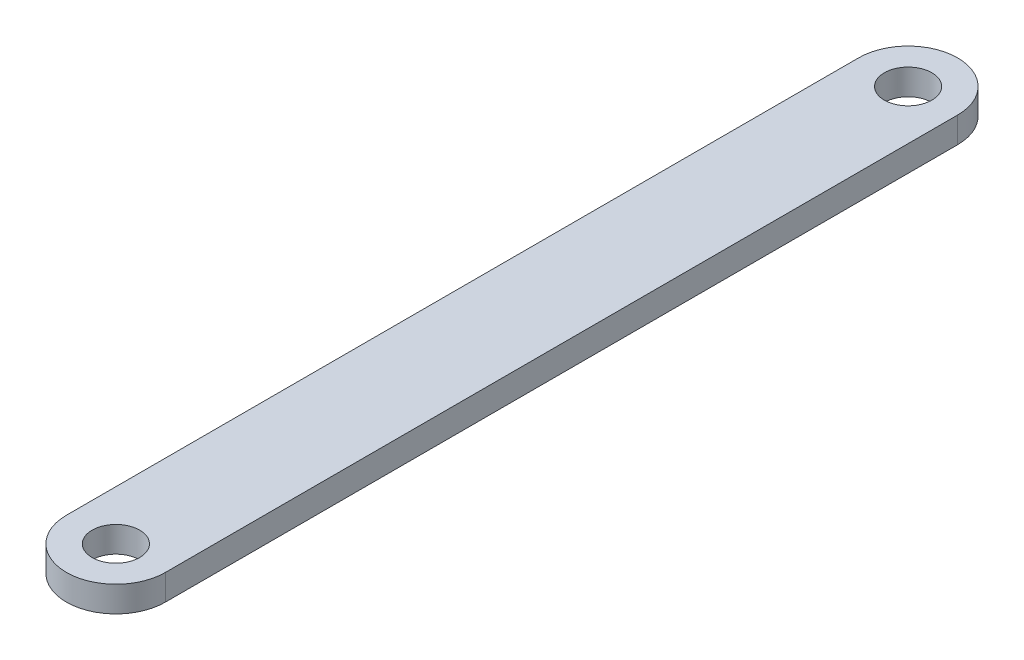
ISO-10303-21;
HEADER;
FILE_DESCRIPTION(('STEP AP214'),'2;1');
FILE_NAME('part.step','',(''),(''),'','','');
FILE_SCHEMA(('AUTOMOTIVE_DESIGN { 1 0 10303 214 1 1 1 1 }'));
ENDSEC;
DATA;
#1=APPLICATION_CONTEXT('core data for automotive mechanical design processes');
#2=APPLICATION_PROTOCOL_DEFINITION('international standard','automotive_design',2000,#1);
#3=PRODUCT_CONTEXT('',#1,'mechanical');
#4=PRODUCT('Part','Part','',(#3));
#5=PRODUCT_RELATED_PRODUCT_CATEGORY('part','',(#4));
#6=PRODUCT_DEFINITION_FORMATION('','',#4);
#7=PRODUCT_DEFINITION_CONTEXT('part definition',#1,'design');
#8=PRODUCT_DEFINITION('design','',#6,#7);
#9=PRODUCT_DEFINITION_SHAPE('','',#8);
#10=(LENGTH_UNIT() NAMED_UNIT(*) SI_UNIT(.MILLI.,.METRE.));
#11=(NAMED_UNIT(*) PLANE_ANGLE_UNIT() SI_UNIT($,.RADIAN.));
#12=(NAMED_UNIT(*) SI_UNIT($,.STERADIAN.) SOLID_ANGLE_UNIT());
#13=UNCERTAINTY_MEASURE_WITH_UNIT(LENGTH_MEASURE(1.E-05),#10,'distance_accuracy_value','');
#14=(GEOMETRIC_REPRESENTATION_CONTEXT(3) GLOBAL_UNCERTAINTY_ASSIGNED_CONTEXT((#13)) GLOBAL_UNIT_ASSIGNED_CONTEXT((#10,
#11,#12)) REPRESENTATION_CONTEXT('',''));
#15=CARTESIAN_POINT('',(0.,0.,0.));
#16=DIRECTION('',(0.,0.,1.));
#17=DIRECTION('',(1.,0.,0.));
#18=AXIS2_PLACEMENT_3D('',#15,#16,#17);
#19=CARTESIAN_POINT('',(0.,3.25,0.));
#20=DIRECTION('',(0.,1.,0.));
#21=DIRECTION('',(0.,0.,1.));
#22=AXIS2_PLACEMENT_3D('',#19,#20,#21);
#23=PLANE('',#22);
#24=CARTESIAN_POINT('',(0.,3.25,-200.));
#25=DIRECTION('',(0.,1.,0.));
#26=DIRECTION('',(0.,0.,1.));
#27=AXIS2_PLACEMENT_3D('',#24,#25,#26);
#28=CIRCLE('',#27,6.);
#29=CARTESIAN_POINT('',(0.,3.25,-206.));
#30=VERTEX_POINT('',#29);
#31=EDGE_CURVE('E106',#30,#30,#28,.T.);
#32=ORIENTED_EDGE('',*,*,#31,.F.);
#33=EDGE_LOOP('',(#32));
#34=FACE_BOUND('',#33,.T.);
#35=CARTESIAN_POINT('',(0.,3.25,0.));
#36=DIRECTION('',(0.,1.,0.));
#37=DIRECTION('',(0.,0.,1.));
#38=AXIS2_PLACEMENT_3D('',#35,#36,#37);
#39=CIRCLE('',#38,12.5);
#40=CARTESIAN_POINT('',(-12.5,3.25,0.));
#41=VERTEX_POINT('',#40);
#42=CARTESIAN_POINT('',(12.5,3.25,0.));
#43=VERTEX_POINT('',#42);
#44=EDGE_CURVE('E91',#41,#43,#39,.T.);
#45=ORIENTED_EDGE('',*,*,#44,.T.);
#46=DIRECTION('',(0.,0.,-1.));
#47=VECTOR('',#46,1.);
#48=CARTESIAN_POINT('',(12.5,3.25,0.));
#49=LINE('',#48,#47);
#50=CARTESIAN_POINT('',(12.5,3.25,-200.));
#51=VERTEX_POINT('',#50);
#52=EDGE_CURVE('E86',#43,#51,#49,.T.);
#53=ORIENTED_EDGE('',*,*,#52,.T.);
#54=CARTESIAN_POINT('',(0.,3.25,-200.));
#55=DIRECTION('',(0.,1.,0.));
#56=DIRECTION('',(0.,0.,1.));
#57=AXIS2_PLACEMENT_3D('',#54,#55,#56);
#58=CIRCLE('',#57,12.5);
#59=CARTESIAN_POINT('',(-12.5,3.25,-200.));
#60=VERTEX_POINT('',#59);
#61=EDGE_CURVE('E87',#51,#60,#58,.T.);
#62=ORIENTED_EDGE('',*,*,#61,.T.);
#63=DIRECTION('',(0.,0.,1.));
#64=VECTOR('',#63,1.);
#65=CARTESIAN_POINT('',(-12.5,3.25,0.));
#66=LINE('',#65,#64);
#67=EDGE_CURVE('E57',#60,#41,#66,.T.);
#68=ORIENTED_EDGE('',*,*,#67,.T.);
#69=EDGE_LOOP('',(#45,#53,#62,#68));
#70=FACE_BOUND('',#69,.T.);
#71=CARTESIAN_POINT('',(0.,3.25,0.));
#72=DIRECTION('',(0.,1.,0.));
#73=DIRECTION('',(0.,0.,1.));
#74=AXIS2_PLACEMENT_3D('',#71,#72,#73);
#75=CIRCLE('',#74,6.);
#76=CARTESIAN_POINT('',(0.,3.25,-6.));
#77=VERTEX_POINT('',#76);
#78=EDGE_CURVE('E123',#77,#77,#75,.T.);
#79=ORIENTED_EDGE('',*,*,#78,.F.);
#80=EDGE_LOOP('',(#79));
#81=FACE_BOUND('',#80,.T.);
#82=ADVANCED_FACE('F39',(#34,#70,#81),#23,.T.);
#83=CARTESIAN_POINT('',(0.,-3.25,0.));
#84=DIRECTION('',(0.,1.,0.));
#85=DIRECTION('',(0.,0.,1.));
#86=AXIS2_PLACEMENT_3D('',#83,#84,#85);
#87=PLANE('',#86);
#88=CARTESIAN_POINT('',(0.,-3.25,0.));
#89=DIRECTION('',(0.,1.,0.));
#90=DIRECTION('',(0.,0.,1.));
#91=AXIS2_PLACEMENT_3D('',#88,#89,#90);
#92=CIRCLE('',#91,12.5);
#93=CARTESIAN_POINT('',(-12.5,-3.25,0.));
#94=VERTEX_POINT('',#93);
#95=CARTESIAN_POINT('',(12.5,-3.25,0.));
#96=VERTEX_POINT('',#95);
#97=EDGE_CURVE('E104',#94,#96,#92,.T.);
#98=ORIENTED_EDGE('',*,*,#97,.F.);
#99=DIRECTION('',(0.,0.,1.));
#100=VECTOR('',#99,1.);
#101=CARTESIAN_POINT('',(-12.5,-3.25,0.));
#102=LINE('',#101,#100);
#103=CARTESIAN_POINT('',(-12.5,-3.25,-200.));
#104=VERTEX_POINT('',#103);
#105=EDGE_CURVE('E80',#104,#94,#102,.T.);
#106=ORIENTED_EDGE('',*,*,#105,.F.);
#107=CARTESIAN_POINT('',(0.,-3.25,-200.));
#108=DIRECTION('',(0.,1.,0.));
#109=DIRECTION('',(0.,0.,1.));
#110=AXIS2_PLACEMENT_3D('',#107,#108,#109);
#111=CIRCLE('',#110,12.5);
#112=CARTESIAN_POINT('',(12.5,-3.25,-200.));
#113=VERTEX_POINT('',#112);
#114=EDGE_CURVE('E74',#113,#104,#111,.T.);
#115=ORIENTED_EDGE('',*,*,#114,.F.);
#116=DIRECTION('',(0.,0.,-1.));
#117=VECTOR('',#116,1.);
#118=CARTESIAN_POINT('',(12.5,-3.25,0.));
#119=LINE('',#118,#117);
#120=EDGE_CURVE('E94',#96,#113,#119,.T.);
#121=ORIENTED_EDGE('',*,*,#120,.F.);
#122=EDGE_LOOP('',(#98,#106,#115,#121));
#123=FACE_BOUND('',#122,.T.);
#124=CARTESIAN_POINT('',(0.,-3.25,-200.));
#125=DIRECTION('',(0.,1.,0.));
#126=DIRECTION('',(0.,0.,1.));
#127=AXIS2_PLACEMENT_3D('',#124,#125,#126);
#128=CIRCLE('',#127,6.);
#129=CARTESIAN_POINT('',(0.,-3.25,-206.));
#130=VERTEX_POINT('',#129);
#131=EDGE_CURVE('E119',#130,#130,#128,.T.);
#132=ORIENTED_EDGE('',*,*,#131,.T.);
#133=EDGE_LOOP('',(#132));
#134=FACE_BOUND('',#133,.T.);
#135=CARTESIAN_POINT('',(0.,-3.25,0.));
#136=DIRECTION('',(0.,1.,0.));
#137=DIRECTION('',(0.,0.,1.));
#138=AXIS2_PLACEMENT_3D('',#135,#136,#137);
#139=CIRCLE('',#138,6.);
#140=CARTESIAN_POINT('',(0.,-3.25,-6.));
#141=VERTEX_POINT('',#140);
#142=EDGE_CURVE('E125',#141,#141,#139,.T.);
#143=ORIENTED_EDGE('',*,*,#142,.T.);
#144=EDGE_LOOP('',(#143));
#145=FACE_BOUND('',#144,.T.);
#146=ADVANCED_FACE('F114',(#123,#134,#145),#87,.F.);
#147=CARTESIAN_POINT('',(0.,3.25,0.));
#148=DIRECTION('',(0.,-1.,0.));
#149=DIRECTION('',(0.,0.,-1.));
#150=AXIS2_PLACEMENT_3D('',#147,#148,#149);
#151=CYLINDRICAL_SURFACE('',#150,12.5);
#152=ORIENTED_EDGE('',*,*,#97,.T.);
#153=DIRECTION('',(0.,-1.,0.));
#154=VECTOR('',#153,1.);
#155=CARTESIAN_POINT('',(12.5,3.25,0.));
#156=LINE('',#155,#154);
#157=EDGE_CURVE('E11',#43,#96,#156,.T.);
#158=ORIENTED_EDGE('',*,*,#157,.F.);
#159=ORIENTED_EDGE('',*,*,#44,.F.);
#160=DIRECTION('',(0.,-1.,0.));
#161=VECTOR('',#160,1.);
#162=CARTESIAN_POINT('',(-12.5,3.25,0.));
#163=LINE('',#162,#161);
#164=EDGE_CURVE('E98',#41,#94,#163,.T.);
#165=ORIENTED_EDGE('',*,*,#164,.T.);
#166=EDGE_LOOP('',(#152,#158,#159,#165));
#167=FACE_BOUND('',#166,.T.);
#168=ADVANCED_FACE('F41',(#167),#151,.T.);
#169=CARTESIAN_POINT('',(12.5,3.25,0.));
#170=DIRECTION('',(-1.,0.,0.));
#171=DIRECTION('',(0.,0.,1.));
#172=AXIS2_PLACEMENT_3D('',#169,#170,#171);
#173=PLANE('',#172);
#174=ORIENTED_EDGE('',*,*,#120,.T.);
#175=DIRECTION('',(0.,-1.,0.));
#176=VECTOR('',#175,1.);
#177=CARTESIAN_POINT('',(12.5,3.25,-200.));
#178=LINE('',#177,#176);
#179=EDGE_CURVE('E48',#51,#113,#178,.T.);
#180=ORIENTED_EDGE('',*,*,#179,.F.);
#181=ORIENTED_EDGE('',*,*,#52,.F.);
#182=ORIENTED_EDGE('',*,*,#157,.T.);
#183=EDGE_LOOP('',(#174,#180,#181,#182));
#184=FACE_BOUND('',#183,.T.);
#185=ADVANCED_FACE('F92',(#184),#173,.F.);
#186=CARTESIAN_POINT('',(0.,3.25,-200.));
#187=DIRECTION('',(0.,-1.,0.));
#188=DIRECTION('',(0.,0.,-1.));
#189=AXIS2_PLACEMENT_3D('',#186,#187,#188);
#190=CYLINDRICAL_SURFACE('',#189,12.5);
#191=ORIENTED_EDGE('',*,*,#114,.T.);
#192=DIRECTION('',(0.,-1.,0.));
#193=VECTOR('',#192,1.);
#194=CARTESIAN_POINT('',(-12.5,3.25,-200.));
#195=LINE('',#194,#193);
#196=EDGE_CURVE('E96',#60,#104,#195,.T.);
#197=ORIENTED_EDGE('',*,*,#196,.F.);
#198=ORIENTED_EDGE('',*,*,#61,.F.);
#199=ORIENTED_EDGE('',*,*,#179,.T.);
#200=EDGE_LOOP('',(#191,#197,#198,#199));
#201=FACE_BOUND('',#200,.T.);
#202=ADVANCED_FACE('F100',(#201),#190,.T.);
#203=CARTESIAN_POINT('',(-12.5,3.25,0.));
#204=DIRECTION('',(1.,0.,0.));
#205=DIRECTION('',(0.,0.,-1.));
#206=AXIS2_PLACEMENT_3D('',#203,#204,#205);
#207=PLANE('',#206);
#208=ORIENTED_EDGE('',*,*,#105,.T.);
#209=ORIENTED_EDGE('',*,*,#164,.F.);
#210=ORIENTED_EDGE('',*,*,#67,.F.);
#211=ORIENTED_EDGE('',*,*,#196,.T.);
#212=EDGE_LOOP('',(#208,#209,#210,#211));
#213=FACE_BOUND('',#212,.T.);
#214=ADVANCED_FACE('F112',(#213),#207,.F.);
#215=CARTESIAN_POINT('',(0.,3.25,-200.));
#216=DIRECTION('',(0.,-1.,0.));
#217=DIRECTION('',(0.,0.,-1.));
#218=AXIS2_PLACEMENT_3D('',#215,#216,#217);
#219=CYLINDRICAL_SURFACE('',#218,6.);
#220=CARTESIAN_POINT('',(0.,3.25,-206.));
#221=CARTESIAN_POINT('',(0.,3.18229166666667,-206.));
#222=CARTESIAN_POINT('',(0.,3.11458333333333,-206.));
#223=CARTESIAN_POINT('',(0.,2.97916666666667,-206.));
#224=CARTESIAN_POINT('',(0.,2.91145833333333,-206.));
#225=CARTESIAN_POINT('',(0.,2.77604166666667,-206.));
#226=CARTESIAN_POINT('',(0.,2.70833333333333,-206.));
#227=CARTESIAN_POINT('',(0.,2.57291666666667,-206.));
#228=CARTESIAN_POINT('',(0.,2.50520833333333,-206.));
#229=CARTESIAN_POINT('',(0.,2.36979166666667,-206.));
#230=CARTESIAN_POINT('',(0.,2.30208333333333,-206.));
#231=CARTESIAN_POINT('',(0.,2.16666666666667,-206.));
#232=CARTESIAN_POINT('',(0.,2.09895833333333,-206.));
#233=CARTESIAN_POINT('',(0.,1.96354166666667,-206.));
#234=CARTESIAN_POINT('',(0.,1.89583333333333,-206.));
#235=CARTESIAN_POINT('',(0.,1.76041666666667,-206.));
#236=CARTESIAN_POINT('',(0.,1.69270833333333,-206.));
#237=CARTESIAN_POINT('',(0.,1.55729166666667,-206.));
#238=CARTESIAN_POINT('',(0.,1.48958333333333,-206.));
#239=CARTESIAN_POINT('',(0.,1.35416666666667,-206.));
#240=CARTESIAN_POINT('',(0.,1.28645833333333,-206.));
#241=CARTESIAN_POINT('',(0.,1.15104166666667,-206.));
#242=CARTESIAN_POINT('',(0.,1.08333333333333,-206.));
#243=CARTESIAN_POINT('',(0.,0.947916666666667,-206.));
#244=CARTESIAN_POINT('',(0.,0.880208333333333,-206.));
#245=CARTESIAN_POINT('',(0.,0.744791666666667,-206.));
#246=CARTESIAN_POINT('',(0.,0.677083333333333,-206.));
#247=CARTESIAN_POINT('',(0.,0.541666666666667,-206.));
#248=CARTESIAN_POINT('',(0.,0.473958333333333,-206.));
#249=CARTESIAN_POINT('',(0.,0.338541666666667,-206.));
#250=CARTESIAN_POINT('',(0.,0.270833333333333,-206.));
#251=CARTESIAN_POINT('',(0.,0.135416666666667,-206.));
#252=CARTESIAN_POINT('',(0.,0.0677083333333334,-206.));
#253=CARTESIAN_POINT('',(0.,-0.0677083333333334,-206.));
#254=CARTESIAN_POINT('',(0.,-0.135416666666667,-206.));
#255=CARTESIAN_POINT('',(0.,-0.270833333333333,-206.));
#256=CARTESIAN_POINT('',(0.,-0.338541666666667,-206.));
#257=CARTESIAN_POINT('',(0.,-0.473958333333333,-206.));
#258=CARTESIAN_POINT('',(0.,-0.541666666666667,-206.));
#259=CARTESIAN_POINT('',(0.,-0.677083333333333,-206.));
#260=CARTESIAN_POINT('',(0.,-0.744791666666666,-206.));
#261=CARTESIAN_POINT('',(0.,-0.880208333333333,-206.));
#262=CARTESIAN_POINT('',(0.,-0.947916666666666,-206.));
#263=CARTESIAN_POINT('',(0.,-1.08333333333333,-206.));
#264=CARTESIAN_POINT('',(0.,-1.15104166666667,-206.));
#265=CARTESIAN_POINT('',(0.,-1.28645833333333,-206.));
#266=CARTESIAN_POINT('',(0.,-1.35416666666667,-206.));
#267=CARTESIAN_POINT('',(0.,-1.48958333333333,-206.));
#268=CARTESIAN_POINT('',(0.,-1.55729166666667,-206.));
#269=CARTESIAN_POINT('',(0.,-1.69270833333333,-206.));
#270=CARTESIAN_POINT('',(0.,-1.76041666666667,-206.));
#271=CARTESIAN_POINT('',(0.,-1.89583333333333,-206.));
#272=CARTESIAN_POINT('',(0.,-1.96354166666667,-206.));
#273=CARTESIAN_POINT('',(0.,-2.09895833333333,-206.));
#274=CARTESIAN_POINT('',(0.,-2.16666666666667,-206.));
#275=CARTESIAN_POINT('',(0.,-2.30208333333333,-206.));
#276=CARTESIAN_POINT('',(0.,-2.36979166666667,-206.));
#277=CARTESIAN_POINT('',(0.,-2.50520833333333,-206.));
#278=CARTESIAN_POINT('',(0.,-2.57291666666667,-206.));
#279=CARTESIAN_POINT('',(0.,-2.70833333333333,-206.));
#280=CARTESIAN_POINT('',(0.,-2.77604166666667,-206.));
#281=CARTESIAN_POINT('',(0.,-2.91145833333333,-206.));
#282=CARTESIAN_POINT('',(0.,-2.97916666666667,-206.));
#283=CARTESIAN_POINT('',(0.,-3.11458333333333,-206.));
#284=CARTESIAN_POINT('',(0.,-3.18229166666667,-206.));
#285=CARTESIAN_POINT('',(0.,-3.25,-206.));
#286=B_SPLINE_CURVE_WITH_KNOTS('',3,(#220,#221,#222,#223,#224,#225,#226,#227,#228,#229,#230,
#231,#232,#233,#234,#235,#236,#237,#238,#239,#240,#241,#242,#243,#244,#245,#246,#247,#248,#249,
#250,#251,#252,#253,#254,#255,#256,#257,#258,#259,#260,#261,#262,#263,#264,#265,#266,#267,#268,
#269,#270,#271,#272,#273,#274,#275,#276,#277,#278,#279,#280,#281,#282,#283,#284,#285),
.UNSPECIFIED.,.F.,.F.,(4,2,2,2,2,2,2,2,2,2,2,2,2,2,2,2,2,2,2,2,2,2,2,2,2,2,2,2,2,2,2,2,4),(0.,
0.203125,0.40625,0.609375,0.8125,1.015625,1.21875,1.421875,1.625,1.828125,2.03125,2.234375,
2.4375,2.640625,2.84375,3.046875,3.25,3.453125,3.65625,3.859375,4.0625,4.265625,4.46875,
4.671875,4.875,5.078125,5.28125,5.484375,5.6875,5.890625,6.09375,6.296875,6.5),.UNSPECIFIED.);
#287=EDGE_CURVE('BSEAM141',#30,#130,#286,.T.);
#288=ORIENTED_EDGE('',*,*,#31,.T.);
#289=ORIENTED_EDGE('',*,*,#131,.F.);
#290=ORIENTED_EDGE('',*,*,#287,.T.);
#291=ORIENTED_EDGE('',*,*,#287,.F.);
#292=EDGE_LOOP('',(#288,#290,#289,#291));
#293=FACE_BOUND('',#292,.T.);
#294=ADVANCED_FACE('F141',(#293),#219,.F.);
#295=CARTESIAN_POINT('',(0.,3.25,0.));
#296=DIRECTION('',(0.,-1.,0.));
#297=DIRECTION('',(0.,0.,-1.));
#298=AXIS2_PLACEMENT_3D('',#295,#296,#297);
#299=CYLINDRICAL_SURFACE('',#298,6.);
#300=CARTESIAN_POINT('',(0.,3.25,-6.));
#301=CARTESIAN_POINT('',(0.,3.18229166666667,-6.));
#302=CARTESIAN_POINT('',(0.,3.11458333333333,-6.));
#303=CARTESIAN_POINT('',(0.,2.97916666666667,-6.));
#304=CARTESIAN_POINT('',(0.,2.91145833333333,-6.));
#305=CARTESIAN_POINT('',(0.,2.77604166666667,-6.));
#306=CARTESIAN_POINT('',(0.,2.70833333333333,-6.));
#307=CARTESIAN_POINT('',(0.,2.57291666666667,-6.));
#308=CARTESIAN_POINT('',(0.,2.50520833333333,-6.));
#309=CARTESIAN_POINT('',(0.,2.36979166666667,-6.));
#310=CARTESIAN_POINT('',(0.,2.30208333333333,-6.));
#311=CARTESIAN_POINT('',(0.,2.16666666666667,-6.));
#312=CARTESIAN_POINT('',(0.,2.09895833333333,-6.));
#313=CARTESIAN_POINT('',(0.,1.96354166666667,-6.));
#314=CARTESIAN_POINT('',(0.,1.89583333333333,-6.));
#315=CARTESIAN_POINT('',(0.,1.76041666666667,-6.));
#316=CARTESIAN_POINT('',(0.,1.69270833333333,-6.));
#317=CARTESIAN_POINT('',(0.,1.55729166666667,-6.));
#318=CARTESIAN_POINT('',(0.,1.48958333333333,-6.));
#319=CARTESIAN_POINT('',(0.,1.35416666666667,-6.));
#320=CARTESIAN_POINT('',(0.,1.28645833333333,-6.));
#321=CARTESIAN_POINT('',(0.,1.15104166666667,-6.));
#322=CARTESIAN_POINT('',(0.,1.08333333333333,-6.));
#323=CARTESIAN_POINT('',(0.,0.947916666666667,-6.));
#324=CARTESIAN_POINT('',(0.,0.880208333333333,-6.));
#325=CARTESIAN_POINT('',(0.,0.744791666666667,-6.));
#326=CARTESIAN_POINT('',(0.,0.677083333333333,-6.));
#327=CARTESIAN_POINT('',(0.,0.541666666666667,-6.));
#328=CARTESIAN_POINT('',(0.,0.473958333333333,-6.));
#329=CARTESIAN_POINT('',(0.,0.338541666666667,-6.));
#330=CARTESIAN_POINT('',(0.,0.270833333333333,-6.));
#331=CARTESIAN_POINT('',(0.,0.135416666666667,-6.));
#332=CARTESIAN_POINT('',(0.,0.0677083333333334,-6.));
#333=CARTESIAN_POINT('',(0.,-0.0677083333333334,-6.));
#334=CARTESIAN_POINT('',(0.,-0.135416666666667,-6.));
#335=CARTESIAN_POINT('',(0.,-0.270833333333333,-6.));
#336=CARTESIAN_POINT('',(0.,-0.338541666666667,-6.));
#337=CARTESIAN_POINT('',(0.,-0.473958333333333,-6.));
#338=CARTESIAN_POINT('',(0.,-0.541666666666667,-6.));
#339=CARTESIAN_POINT('',(0.,-0.677083333333333,-6.));
#340=CARTESIAN_POINT('',(0.,-0.744791666666666,-6.));
#341=CARTESIAN_POINT('',(0.,-0.880208333333333,-6.));
#342=CARTESIAN_POINT('',(0.,-0.947916666666666,-6.));
#343=CARTESIAN_POINT('',(0.,-1.08333333333333,-6.));
#344=CARTESIAN_POINT('',(0.,-1.15104166666667,-6.));
#345=CARTESIAN_POINT('',(0.,-1.28645833333333,-6.));
#346=CARTESIAN_POINT('',(0.,-1.35416666666667,-6.));
#347=CARTESIAN_POINT('',(0.,-1.48958333333333,-6.));
#348=CARTESIAN_POINT('',(0.,-1.55729166666667,-6.));
#349=CARTESIAN_POINT('',(0.,-1.69270833333333,-6.));
#350=CARTESIAN_POINT('',(0.,-1.76041666666667,-6.));
#351=CARTESIAN_POINT('',(0.,-1.89583333333333,-6.));
#352=CARTESIAN_POINT('',(0.,-1.96354166666667,-6.));
#353=CARTESIAN_POINT('',(0.,-2.09895833333333,-6.));
#354=CARTESIAN_POINT('',(0.,-2.16666666666667,-6.));
#355=CARTESIAN_POINT('',(0.,-2.30208333333333,-6.));
#356=CARTESIAN_POINT('',(0.,-2.36979166666667,-6.));
#357=CARTESIAN_POINT('',(0.,-2.50520833333333,-6.));
#358=CARTESIAN_POINT('',(0.,-2.57291666666667,-6.));
#359=CARTESIAN_POINT('',(0.,-2.70833333333333,-6.));
#360=CARTESIAN_POINT('',(0.,-2.77604166666667,-6.));
#361=CARTESIAN_POINT('',(0.,-2.91145833333333,-6.));
#362=CARTESIAN_POINT('',(0.,-2.97916666666667,-6.));
#363=CARTESIAN_POINT('',(0.,-3.11458333333333,-6.));
#364=CARTESIAN_POINT('',(0.,-3.18229166666667,-6.));
#365=CARTESIAN_POINT('',(0.,-3.25,-6.));
#366=B_SPLINE_CURVE_WITH_KNOTS('',3,(#300,#301,#302,#303,#304,#305,#306,#307,#308,#309,#310,
#311,#312,#313,#314,#315,#316,#317,#318,#319,#320,#321,#322,#323,#324,#325,#326,#327,#328,#329,
#330,#331,#332,#333,#334,#335,#336,#337,#338,#339,#340,#341,#342,#343,#344,#345,#346,#347,#348,
#349,#350,#351,#352,#353,#354,#355,#356,#357,#358,#359,#360,#361,#362,#363,#364,#365),
.UNSPECIFIED.,.F.,.F.,(4,2,2,2,2,2,2,2,2,2,2,2,2,2,2,2,2,2,2,2,2,2,2,2,2,2,2,2,2,2,2,2,4),(0.,
0.203125,0.40625,0.609375,0.8125,1.015625,1.21875,1.421875,1.625,1.828125,2.03125,2.234375,
2.4375,2.640625,2.84375,3.046875,3.25,3.453125,3.65625,3.859375,4.0625,4.265625,4.46875,
4.671875,4.875,5.078125,5.28125,5.484375,5.6875,5.890625,6.09375,6.296875,6.5),.UNSPECIFIED.);
#367=EDGE_CURVE('BSEAM127',#77,#141,#366,.T.);
#368=ORIENTED_EDGE('',*,*,#78,.T.);
#369=ORIENTED_EDGE('',*,*,#142,.F.);
#370=ORIENTED_EDGE('',*,*,#367,.T.);
#371=ORIENTED_EDGE('',*,*,#367,.F.);
#372=EDGE_LOOP('',(#368,#370,#369,#371));
#373=FACE_BOUND('',#372,.T.);
#374=ADVANCED_FACE('F127',(#373),#299,.F.);
#375=CLOSED_SHELL('',(#82,#146,#168,#185,#202,#214,#294,#374));
#376=MANIFOLD_SOLID_BREP('B2',#375);
#377=ADVANCED_BREP_SHAPE_REPRESENTATION('',(#18,#376),#14);
#378=SHAPE_DEFINITION_REPRESENTATION(#9,#377);
ENDSEC;
END-ISO-10303-21;
